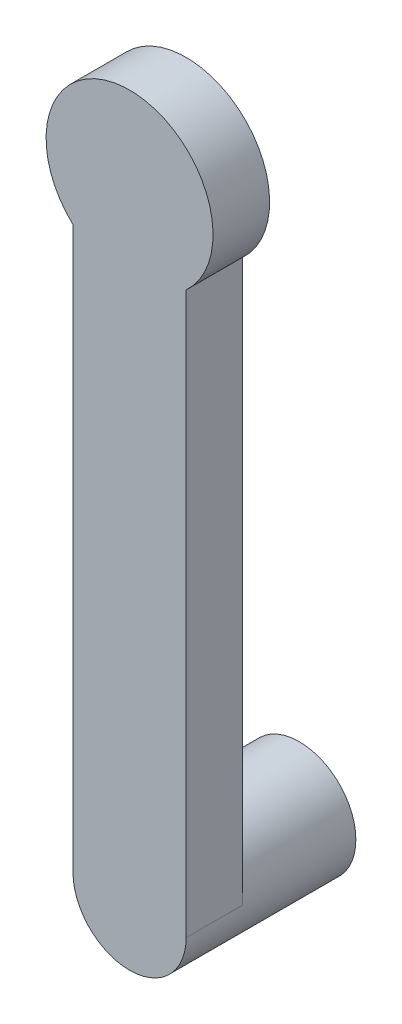
ISO-10303-21;
HEADER;
FILE_DESCRIPTION(('STEP AP214'),'2;1');
FILE_NAME('part.step','',(''),(''),'','','');
FILE_SCHEMA(('AUTOMOTIVE_DESIGN { 1 0 10303 214 1 1 1 1 }'));
ENDSEC;
DATA;
#1=APPLICATION_CONTEXT('core data for automotive mechanical design processes');
#2=APPLICATION_PROTOCOL_DEFINITION('international standard','automotive_design',2000,#1);
#3=PRODUCT_CONTEXT('',#1,'mechanical');
#4=PRODUCT('Part','Part','',(#3));
#5=PRODUCT_RELATED_PRODUCT_CATEGORY('part','',(#4));
#6=PRODUCT_DEFINITION_FORMATION('','',#4);
#7=PRODUCT_DEFINITION_CONTEXT('part definition',#1,'design');
#8=PRODUCT_DEFINITION('design','',#6,#7);
#9=PRODUCT_DEFINITION_SHAPE('','',#8);
#10=(LENGTH_UNIT() NAMED_UNIT(*) SI_UNIT(.MILLI.,.METRE.));
#11=(NAMED_UNIT(*) PLANE_ANGLE_UNIT() SI_UNIT($,.RADIAN.));
#12=(NAMED_UNIT(*) SI_UNIT($,.STERADIAN.) SOLID_ANGLE_UNIT());
#13=UNCERTAINTY_MEASURE_WITH_UNIT(LENGTH_MEASURE(1.E-05),#10,'distance_accuracy_value','');
#14=(GEOMETRIC_REPRESENTATION_CONTEXT(3) GLOBAL_UNCERTAINTY_ASSIGNED_CONTEXT((#13)) GLOBAL_UNIT_ASSIGNED_CONTEXT((#10,
#11,#12)) REPRESENTATION_CONTEXT('',''));
#15=CARTESIAN_POINT('',(0.,0.,0.));
#16=DIRECTION('',(0.,0.,1.));
#17=DIRECTION('',(1.,0.,0.));
#18=AXIS2_PLACEMENT_3D('',#15,#16,#17);
#19=CARTESIAN_POINT('',(0.,0.,10.));
#20=DIRECTION('',(0.,0.,1.));
#21=DIRECTION('',(1.,0.,0.));
#22=AXIS2_PLACEMENT_3D('',#19,#20,#21);
#23=PLANE('',#22);
#24=CARTESIAN_POINT('',(0.,0.,10.));
#25=DIRECTION('',(0.,0.,-1.));
#26=DIRECTION('',(1.,0.,0.));
#27=AXIS2_PLACEMENT_3D('',#24,#25,#26);
#28=CIRCLE('',#27,5.);
#29=CARTESIAN_POINT('',(-5.,0.,10.));
#30=VERTEX_POINT('',#29);
#31=CARTESIAN_POINT('',(5.,0.,10.));
#32=VERTEX_POINT('',#31);
#33=EDGE_CURVE('E101',#30,#32,#28,.T.);
#34=ORIENTED_EDGE('',*,*,#33,.F.);
#35=DIRECTION('',(0.,1.,0.));
#36=VECTOR('',#35,1.);
#37=CARTESIAN_POINT('',(-5.,0.,10.));
#38=LINE('',#37,#36);
#39=CARTESIAN_POINT('',(-5.,49.5752637508403,10.));
#40=VERTEX_POINT('',#39);
#41=EDGE_CURVE('E11',#30,#40,#38,.T.);
#42=ORIENTED_EDGE('',*,*,#41,.T.);
#43=CARTESIAN_POINT('',(0.,55.,10.));
#44=DIRECTION('',(0.,0.,-1.));
#45=DIRECTION('',(0.,-1.,0.));
#46=AXIS2_PLACEMENT_3D('',#43,#44,#45);
#47=CIRCLE('',#46,7.37751742613649);
#48=CARTESIAN_POINT('',(5.,49.5752637508403,10.));
#49=VERTEX_POINT('',#48);
#50=EDGE_CURVE('E43',#40,#49,#47,.T.);
#51=ORIENTED_EDGE('',*,*,#50,.T.);
#52=DIRECTION('',(0.,-1.,0.));
#53=VECTOR('',#52,1.);
#54=CARTESIAN_POINT('',(5.,49.5752637508403,10.));
#55=LINE('',#54,#53);
#56=EDGE_CURVE('E114',#49,#32,#55,.T.);
#57=ORIENTED_EDGE('',*,*,#56,.T.);
#58=EDGE_LOOP('',(#34,#42,#51,#57));
#59=FACE_BOUND('',#58,.T.);
#60=ADVANCED_FACE('F17',(#59),#23,.F.);
#61=CARTESIAN_POINT('',(-5.,0.,10.));
#62=DIRECTION('',(1.,0.,0.));
#63=DIRECTION('',(0.,1.,0.));
#64=AXIS2_PLACEMENT_3D('',#61,#62,#63);
#65=PLANE('',#64);
#66=DIRECTION('',(0.,1.,0.));
#67=VECTOR('',#66,1.);
#68=CARTESIAN_POINT('',(-5.,0.,15.));
#69=LINE('',#68,#67);
#70=CARTESIAN_POINT('',(-5.,0.,15.));
#71=VERTEX_POINT('',#70);
#72=CARTESIAN_POINT('',(-5.,49.5752637508403,15.));
#73=VERTEX_POINT('',#72);
#74=EDGE_CURVE('E93',#71,#73,#69,.T.);
#75=ORIENTED_EDGE('',*,*,#74,.T.);
#76=DIRECTION('',(0.,0.,1.));
#77=VECTOR('',#76,1.);
#78=CARTESIAN_POINT('',(-5.,49.5752637508403,10.));
#79=LINE('',#78,#77);
#80=EDGE_CURVE('E26',#40,#73,#79,.T.);
#81=ORIENTED_EDGE('',*,*,#80,.F.);
#82=ORIENTED_EDGE('',*,*,#41,.F.);
#83=DIRECTION('',(0.,0.,1.));
#84=VECTOR('',#83,1.);
#85=CARTESIAN_POINT('',(-5.,0.,10.));
#86=LINE('',#85,#84);
#87=EDGE_CURVE('E87',#30,#71,#86,.T.);
#88=ORIENTED_EDGE('',*,*,#87,.T.);
#89=EDGE_LOOP('',(#75,#81,#82,#88));
#90=FACE_BOUND('',#89,.T.);
#91=ADVANCED_FACE('F19',(#90),#65,.F.);
#92=CARTESIAN_POINT('',(0.,55.,10.));
#93=DIRECTION('',(0.,0.,1.));
#94=DIRECTION('',(1.,0.,0.));
#95=AXIS2_PLACEMENT_3D('',#92,#93,#94);
#96=CYLINDRICAL_SURFACE('',#95,7.37751742613649);
#97=CARTESIAN_POINT('',(0.,55.,15.));
#98=DIRECTION('',(0.,0.,-1.));
#99=DIRECTION('',(0.,-1.,0.));
#100=AXIS2_PLACEMENT_3D('',#97,#98,#99);
#101=CIRCLE('',#100,7.37751742613649);
#102=CARTESIAN_POINT('',(5.,49.5752637508403,15.));
#103=VERTEX_POINT('',#102);
#104=EDGE_CURVE('E86',#73,#103,#101,.T.);
#105=ORIENTED_EDGE('',*,*,#104,.T.);
#106=DIRECTION('',(0.,0.,1.));
#107=VECTOR('',#106,1.);
#108=CARTESIAN_POINT('',(5.,49.5752637508403,10.));
#109=LINE('',#108,#107);
#110=EDGE_CURVE('E81',#49,#103,#109,.T.);
#111=ORIENTED_EDGE('',*,*,#110,.F.);
#112=ORIENTED_EDGE('',*,*,#50,.F.);
#113=ORIENTED_EDGE('',*,*,#80,.T.);
#114=EDGE_LOOP('',(#105,#111,#112,#113));
#115=FACE_BOUND('',#114,.T.);
#116=ADVANCED_FACE('F158',(#115),#96,.T.);
#117=CARTESIAN_POINT('',(5.,49.5752637508403,10.));
#118=DIRECTION('',(-1.,0.,0.));
#119=DIRECTION('',(0.,1.,0.));
#120=AXIS2_PLACEMENT_3D('',#117,#118,#119);
#121=PLANE('',#120);
#122=DIRECTION('',(0.,-1.,0.));
#123=VECTOR('',#122,1.);
#124=CARTESIAN_POINT('',(5.,49.5752637508403,15.));
#125=LINE('',#124,#123);
#126=CARTESIAN_POINT('',(5.,0.,15.));
#127=VERTEX_POINT('',#126);
#128=EDGE_CURVE('E74',#103,#127,#125,.T.);
#129=ORIENTED_EDGE('',*,*,#128,.T.);
#130=DIRECTION('',(0.,0.,1.));
#131=VECTOR('',#130,1.);
#132=CARTESIAN_POINT('',(5.,0.,10.));
#133=LINE('',#132,#131);
#134=EDGE_CURVE('E79',#32,#127,#133,.T.);
#135=ORIENTED_EDGE('',*,*,#134,.F.);
#136=ORIENTED_EDGE('',*,*,#56,.F.);
#137=ORIENTED_EDGE('',*,*,#110,.T.);
#138=EDGE_LOOP('',(#129,#135,#136,#137));
#139=FACE_BOUND('',#138,.T.);
#140=ADVANCED_FACE('F76',(#139),#121,.F.);
#141=CARTESIAN_POINT('',(0.,0.,0.));
#142=DIRECTION('',(0.,0.,-1.));
#143=DIRECTION('',(0.,-1.,0.));
#144=AXIS2_PLACEMENT_3D('',#141,#142,#143);
#145=PLANE('',#144);
#146=CARTESIAN_POINT('',(0.,0.,0.));
#147=DIRECTION('',(0.,0.,-1.));
#148=DIRECTION('',(1.,0.,0.));
#149=AXIS2_PLACEMENT_3D('',#146,#147,#148);
#150=CIRCLE('',#149,5.);
#151=CARTESIAN_POINT('',(5.,0.,0.));
#152=VERTEX_POINT('',#151);
#153=EDGE_CURVE('E106',#152,#152,#150,.T.);
#154=ORIENTED_EDGE('',*,*,#153,.T.);
#155=EDGE_LOOP('',(#154));
#156=FACE_BOUND('',#155,.T.);
#157=ADVANCED_FACE('F140',(#156),#145,.T.);
#158=CARTESIAN_POINT('',(0.,0.,15.));
#159=DIRECTION('',(0.,0.,-1.));
#160=DIRECTION('',(0.,-1.,0.));
#161=AXIS2_PLACEMENT_3D('',#158,#159,#160);
#162=PLANE('',#161);
#163=CARTESIAN_POINT('',(0.,0.,15.));
#164=DIRECTION('',(0.,0.,-1.));
#165=DIRECTION('',(1.,0.,0.));
#166=AXIS2_PLACEMENT_3D('',#163,#164,#165);
#167=CIRCLE('',#166,5.);
#168=EDGE_CURVE('E90',#127,#71,#167,.T.);
#169=ORIENTED_EDGE('',*,*,#168,.F.);
#170=ORIENTED_EDGE('',*,*,#128,.F.);
#171=ORIENTED_EDGE('',*,*,#104,.F.);
#172=ORIENTED_EDGE('',*,*,#74,.F.);
#173=EDGE_LOOP('',(#169,#170,#171,#172));
#174=FACE_BOUND('',#173,.T.);
#175=ADVANCED_FACE('F91',(#174),#162,.F.);
#176=CARTESIAN_POINT('',(0.,0.,15.));
#177=DIRECTION('',(0.,0.,-1.));
#178=DIRECTION('',(-1.,0.,0.));
#179=AXIS2_PLACEMENT_3D('',#176,#177,#178);
#180=CYLINDRICAL_SURFACE('',#179,5.);
#181=ORIENTED_EDGE('',*,*,#33,.T.);
#182=ORIENTED_EDGE('',*,*,#134,.T.);
#183=ORIENTED_EDGE('',*,*,#168,.T.);
#184=ORIENTED_EDGE('',*,*,#87,.F.);
#185=EDGE_LOOP('',(#181,#182,#183,#184));
#186=FACE_BOUND('',#185,.T.);
#187=ORIENTED_EDGE('',*,*,#153,.F.);
#188=EDGE_LOOP('',(#187));
#189=FACE_BOUND('',#188,.T.);
#190=ADVANCED_FACE('F99',(#186,#189),#180,.T.);
#191=CLOSED_SHELL('',(#60,#91,#116,#140,#157,#175,#190));
#192=MANIFOLD_SOLID_BREP('B1',#191);
#193=ADVANCED_BREP_SHAPE_REPRESENTATION('',(#18,#192),#14);
#194=SHAPE_DEFINITION_REPRESENTATION(#9,#193);
ENDSEC;
END-ISO-10303-21;
